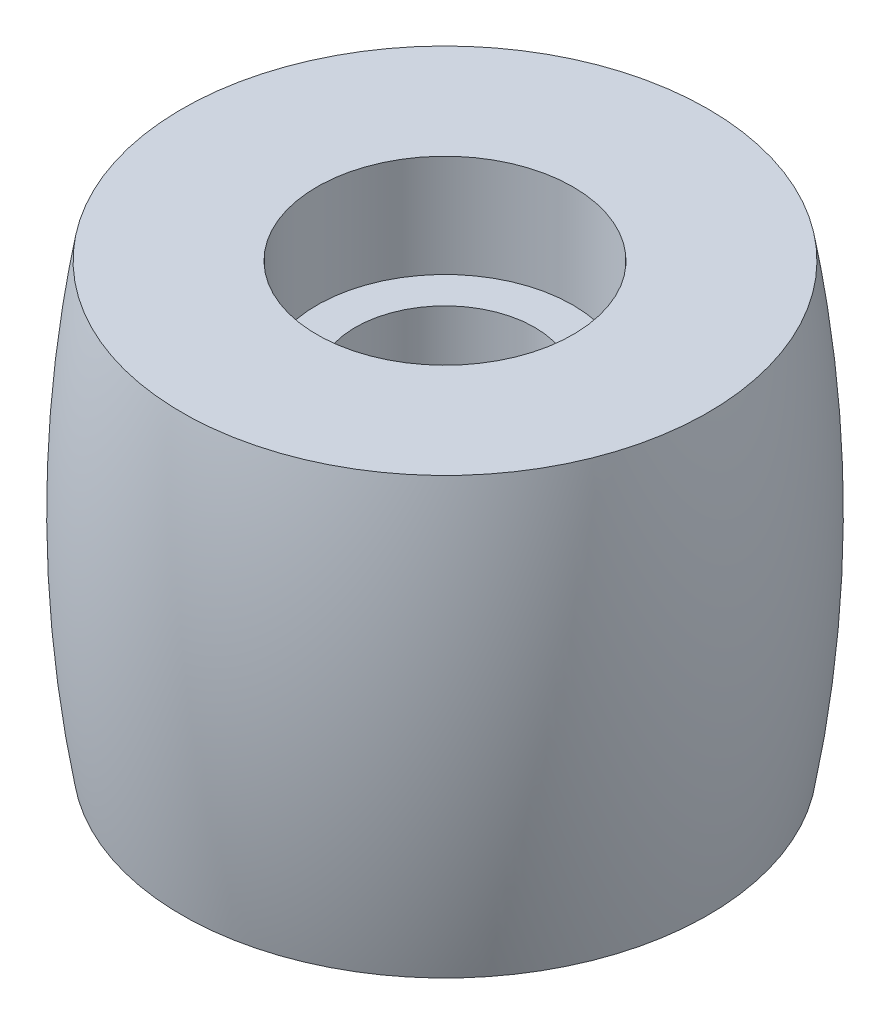
ISO-10303-21;
HEADER;
FILE_DESCRIPTION(('STEP AP214'),'2;1');
FILE_NAME('part.step','',(''),(''),'','','');
FILE_SCHEMA(('AUTOMOTIVE_DESIGN { 1 0 10303 214 1 1 1 1 }'));
ENDSEC;
DATA;
#1=APPLICATION_CONTEXT('core data for automotive mechanical design processes');
#2=APPLICATION_PROTOCOL_DEFINITION('international standard','automotive_design',2000,#1);
#3=PRODUCT_CONTEXT('',#1,'mechanical');
#4=PRODUCT('Part','Part','',(#3));
#5=PRODUCT_RELATED_PRODUCT_CATEGORY('part','',(#4));
#6=PRODUCT_DEFINITION_FORMATION('','',#4);
#7=PRODUCT_DEFINITION_CONTEXT('part definition',#1,'design');
#8=PRODUCT_DEFINITION('design','',#6,#7);
#9=PRODUCT_DEFINITION_SHAPE('','',#8);
#10=(LENGTH_UNIT() NAMED_UNIT(*) SI_UNIT(.MILLI.,.METRE.));
#11=(NAMED_UNIT(*) PLANE_ANGLE_UNIT() SI_UNIT($,.RADIAN.));
#12=(NAMED_UNIT(*) SI_UNIT($,.STERADIAN.) SOLID_ANGLE_UNIT());
#13=UNCERTAINTY_MEASURE_WITH_UNIT(LENGTH_MEASURE(1.E-05),#10,'distance_accuracy_value','');
#14=(GEOMETRIC_REPRESENTATION_CONTEXT(3) GLOBAL_UNCERTAINTY_ASSIGNED_CONTEXT((#13)) GLOBAL_UNIT_ASSIGNED_CONTEXT((#10,
#11,#12)) REPRESENTATION_CONTEXT('',''));
#15=CARTESIAN_POINT('',(0.,0.,0.));
#16=DIRECTION('',(0.,0.,1.));
#17=DIRECTION('',(1.,0.,0.));
#18=AXIS2_PLACEMENT_3D('',#15,#16,#17);
#19=CARTESIAN_POINT('',(3.5,4.49999999999998,0.));
#20=DIRECTION('',(0.,1.,0.));
#21=DIRECTION('',(0.,0.,1.));
#22=AXIS2_PLACEMENT_3D('',#19,#20,#21);
#23=PLANE('',#22);
#24=CARTESIAN_POINT('',(0.,4.49999999999998,0.));
#25=DIRECTION('',(0.,-1.,0.));
#26=DIRECTION('',(0.,0.,-1.));
#27=AXIS2_PLACEMENT_3D('',#24,#25,#26);
#28=CIRCLE('',#27,3.5);
#29=CARTESIAN_POINT('',(0.,4.49999999999998,-3.5));
#30=VERTEX_POINT('',#29);
#31=EDGE_CURVE('E60',#30,#30,#28,.T.);
#32=ORIENTED_EDGE('',*,*,#31,.T.);
#33=EDGE_LOOP('',(#32));
#34=FACE_BOUND('',#33,.T.);
#35=CARTESIAN_POINT('',(0.,4.49999999999998,0.));
#36=DIRECTION('',(0.,-1.,0.));
#37=DIRECTION('',(0.,0.,-1.));
#38=AXIS2_PLACEMENT_3D('',#35,#36,#37);
#39=CIRCLE('',#38,5.);
#40=CARTESIAN_POINT('',(0.,4.49999999999998,-5.));
#41=VERTEX_POINT('',#40);
#42=EDGE_CURVE('E10',#41,#41,#39,.T.);
#43=ORIENTED_EDGE('',*,*,#42,.F.);
#44=EDGE_LOOP('',(#43));
#45=FACE_BOUND('',#44,.T.);
#46=ADVANCED_FACE('F32',(#34,#45),#23,.T.);
#47=CARTESIAN_POINT('',(0.,-169.064981060865,0.));
#48=DIRECTION('',(0.,-1.,0.));
#49=DIRECTION('',(0.,0.,-1.));
#50=AXIS2_PLACEMENT_3D('',#47,#48,#49);
#51=CYLINDRICAL_SURFACE('',#50,5.);
#52=ORIENTED_EDGE('',*,*,#42,.T.);
#53=EDGE_LOOP('',(#52));
#54=FACE_BOUND('',#53,.T.);
#55=CARTESIAN_POINT('',(0.,8.49999999999998,0.));
#56=DIRECTION('',(0.,-1.,0.));
#57=DIRECTION('',(0.,0.,-1.));
#58=AXIS2_PLACEMENT_3D('',#55,#56,#57);
#59=CIRCLE('',#58,5.);
#60=CARTESIAN_POINT('',(0.,8.49999999999998,-5.));
#61=VERTEX_POINT('',#60);
#62=EDGE_CURVE('E38',#61,#61,#59,.T.);
#63=ORIENTED_EDGE('',*,*,#62,.F.);
#64=EDGE_LOOP('',(#63));
#65=FACE_BOUND('',#64,.T.);
#66=ADVANCED_FACE('F78',(#54,#65),#51,.F.);
#67=CARTESIAN_POINT('',(5.,8.49999999999998,0.));
#68=DIRECTION('',(0.,1.,0.));
#69=DIRECTION('',(0.,0.,1.));
#70=AXIS2_PLACEMENT_3D('',#67,#68,#69);
#71=PLANE('',#70);
#72=ORIENTED_EDGE('',*,*,#62,.T.);
#73=EDGE_LOOP('',(#72));
#74=FACE_BOUND('',#73,.T.);
#75=CARTESIAN_POINT('',(0.,8.49999999999998,0.));
#76=DIRECTION('',(0.,-1.,0.));
#77=DIRECTION('',(0.,0.,-1.));
#78=AXIS2_PLACEMENT_3D('',#75,#76,#77);
#79=CIRCLE('',#78,10.2722031169705);
#80=CARTESIAN_POINT('',(0.,8.49999999999998,-10.2722031169705));
#81=VERTEX_POINT('',#80);
#82=EDGE_CURVE('E42',#81,#81,#79,.T.);
#83=ORIENTED_EDGE('',*,*,#82,.F.);
#84=EDGE_LOOP('',(#83));
#85=FACE_BOUND('',#84,.T.);
#86=ADVANCED_FACE('F82',(#74,#85),#71,.T.);
#87=CARTESIAN_POINT('',(0.,0.,0.));
#88=DIRECTION('',(0.,-1.,0.));
#89=DIRECTION('',(0.,0.,-1.));
#90=AXIS2_PLACEMENT_3D('',#87,#88,#89);
#91=DEGENERATE_TOROIDAL_SURFACE('',#90,39.,50.,.F.);
#92=ORIENTED_EDGE('',*,*,#82,.T.);
#93=EDGE_LOOP('',(#92));
#94=FACE_BOUND('',#93,.T.);
#95=CARTESIAN_POINT('',(0.,-8.50000000000004,0.));
#96=DIRECTION('',(0.,-1.,0.));
#97=DIRECTION('',(0.,0.,-1.));
#98=AXIS2_PLACEMENT_3D('',#95,#96,#97);
#99=CIRCLE('',#98,10.2722031169705);
#100=CARTESIAN_POINT('',(0.,-8.50000000000004,-10.2722031169705));
#101=VERTEX_POINT('',#100);
#102=EDGE_CURVE('E46',#101,#101,#99,.T.);
#103=ORIENTED_EDGE('',*,*,#102,.F.);
#104=EDGE_LOOP('',(#103));
#105=FACE_BOUND('',#104,.T.);
#106=ADVANCED_FACE('F86',(#94,#105),#91,.F.);
#107=CARTESIAN_POINT('',(5.,-8.50000000000003,0.));
#108=DIRECTION('',(0.,-1.,0.));
#109=DIRECTION('',(0.,0.,-1.));
#110=AXIS2_PLACEMENT_3D('',#107,#108,#109);
#111=PLANE('',#110);
#112=ORIENTED_EDGE('',*,*,#102,.T.);
#113=EDGE_LOOP('',(#112));
#114=FACE_BOUND('',#113,.T.);
#115=CARTESIAN_POINT('',(0.,-8.50000000000004,0.));
#116=DIRECTION('',(0.,-1.,0.));
#117=DIRECTION('',(0.,0.,-1.));
#118=AXIS2_PLACEMENT_3D('',#115,#116,#117);
#119=CIRCLE('',#118,5.);
#120=CARTESIAN_POINT('',(0.,-8.50000000000004,-5.));
#121=VERTEX_POINT('',#120);
#122=EDGE_CURVE('E51',#121,#121,#119,.T.);
#123=ORIENTED_EDGE('',*,*,#122,.F.);
#124=EDGE_LOOP('',(#123));
#125=FACE_BOUND('',#124,.T.);
#126=ADVANCED_FACE('F92',(#114,#125),#111,.T.);
#127=CARTESIAN_POINT('',(0.,-169.064981060865,0.));
#128=DIRECTION('',(0.,-1.,0.));
#129=DIRECTION('',(0.,0.,-1.));
#130=AXIS2_PLACEMENT_3D('',#127,#128,#129);
#131=CYLINDRICAL_SURFACE('',#130,5.);
#132=ORIENTED_EDGE('',*,*,#122,.T.);
#133=EDGE_LOOP('',(#132));
#134=FACE_BOUND('',#133,.T.);
#135=CARTESIAN_POINT('',(0.,-4.50000000000003,0.));
#136=DIRECTION('',(0.,-1.,0.));
#137=DIRECTION('',(0.,0.,-1.));
#138=AXIS2_PLACEMENT_3D('',#135,#136,#137);
#139=CIRCLE('',#138,5.);
#140=CARTESIAN_POINT('',(0.,-4.50000000000003,-5.));
#141=VERTEX_POINT('',#140);
#142=EDGE_CURVE('E54',#141,#141,#139,.T.);
#143=ORIENTED_EDGE('',*,*,#142,.F.);
#144=EDGE_LOOP('',(#143));
#145=FACE_BOUND('',#144,.T.);
#146=ADVANCED_FACE('F74',(#134,#145),#131,.F.);
#147=CARTESIAN_POINT('',(3.5,-4.50000000000003,0.));
#148=DIRECTION('',(0.,-1.,0.));
#149=DIRECTION('',(0.,0.,-1.));
#150=AXIS2_PLACEMENT_3D('',#147,#148,#149);
#151=PLANE('',#150);
#152=ORIENTED_EDGE('',*,*,#142,.T.);
#153=EDGE_LOOP('',(#152));
#154=FACE_BOUND('',#153,.T.);
#155=CARTESIAN_POINT('',(0.,-4.50000000000003,0.));
#156=DIRECTION('',(0.,-1.,0.));
#157=DIRECTION('',(0.,0.,-1.));
#158=AXIS2_PLACEMENT_3D('',#155,#156,#157);
#159=CIRCLE('',#158,3.5);
#160=CARTESIAN_POINT('',(0.,-4.50000000000003,-3.5));
#161=VERTEX_POINT('',#160);
#162=EDGE_CURVE('E57',#161,#161,#159,.T.);
#163=ORIENTED_EDGE('',*,*,#162,.F.);
#164=EDGE_LOOP('',(#163));
#165=FACE_BOUND('',#164,.T.);
#166=ADVANCED_FACE('F68',(#154,#165),#151,.T.);
#167=CARTESIAN_POINT('',(0.,-169.064981060865,0.));
#168=DIRECTION('',(0.,-1.,0.));
#169=DIRECTION('',(0.,0.,-1.));
#170=AXIS2_PLACEMENT_3D('',#167,#168,#169);
#171=CYLINDRICAL_SURFACE('',#170,3.5);
#172=ORIENTED_EDGE('',*,*,#162,.T.);
#173=EDGE_LOOP('',(#172));
#174=FACE_BOUND('',#173,.T.);
#175=ORIENTED_EDGE('',*,*,#31,.F.);
#176=EDGE_LOOP('',(#175));
#177=FACE_BOUND('',#176,.T.);
#178=ADVANCED_FACE('F66',(#174,#177),#171,.F.);
#179=CLOSED_SHELL('',(#46,#66,#86,#106,#126,#146,#166,#178));
#180=MANIFOLD_SOLID_BREP('B2',#179);
#181=ADVANCED_BREP_SHAPE_REPRESENTATION('',(#18,#180),#14);
#182=SHAPE_DEFINITION_REPRESENTATION(#9,#181);
ENDSEC;
END-ISO-10303-21;
